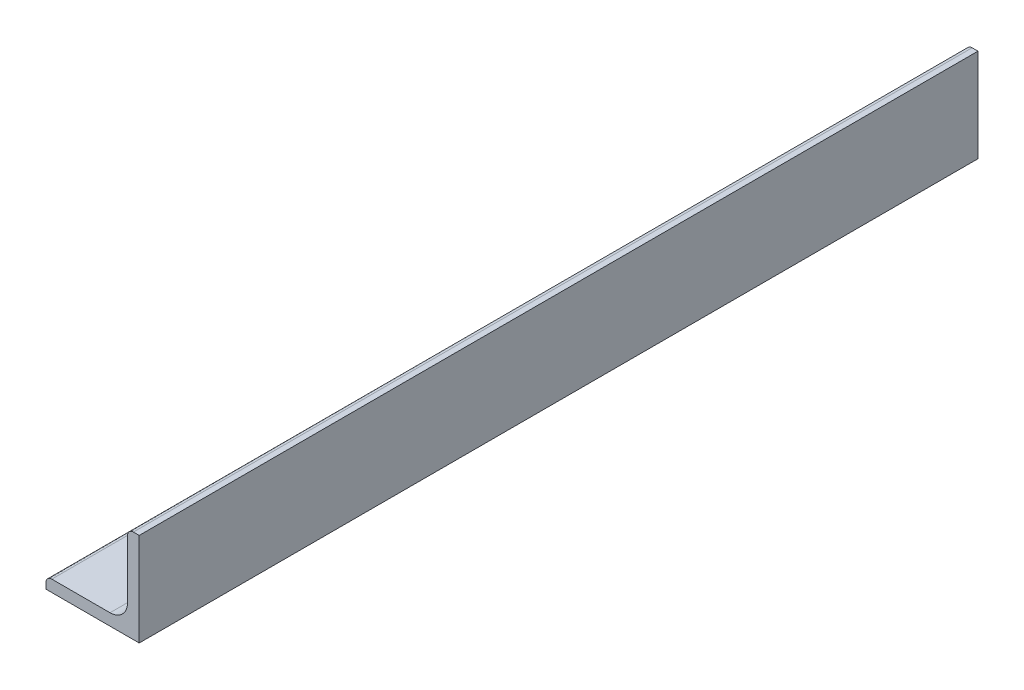
ISO-10303-21;
HEADER;
FILE_DESCRIPTION(('STEP AP214'),'2;1');
FILE_NAME('part.step','',(''),(''),'','','');
FILE_SCHEMA(('AUTOMOTIVE_DESIGN { 1 0 10303 214 1 1 1 1 }'));
ENDSEC;
DATA;
#1=APPLICATION_CONTEXT('core data for automotive mechanical design processes');
#2=APPLICATION_PROTOCOL_DEFINITION('international standard','automotive_design',2000,#1);
#3=PRODUCT_CONTEXT('',#1,'mechanical');
#4=PRODUCT('Part','Part','',(#3));
#5=PRODUCT_RELATED_PRODUCT_CATEGORY('part','',(#4));
#6=PRODUCT_DEFINITION_FORMATION('','',#4);
#7=PRODUCT_DEFINITION_CONTEXT('part definition',#1,'design');
#8=PRODUCT_DEFINITION('design','',#6,#7);
#9=PRODUCT_DEFINITION_SHAPE('','',#8);
#10=(LENGTH_UNIT() NAMED_UNIT(*) SI_UNIT(.MILLI.,.METRE.));
#11=(NAMED_UNIT(*) PLANE_ANGLE_UNIT() SI_UNIT($,.RADIAN.));
#12=(NAMED_UNIT(*) SI_UNIT($,.STERADIAN.) SOLID_ANGLE_UNIT());
#13=UNCERTAINTY_MEASURE_WITH_UNIT(LENGTH_MEASURE(1.E-05),#10,'distance_accuracy_value','');
#14=(GEOMETRIC_REPRESENTATION_CONTEXT(3) GLOBAL_UNCERTAINTY_ASSIGNED_CONTEXT((#13)) GLOBAL_UNIT_ASSIGNED_CONTEXT((#10,
#11,#12)) REPRESENTATION_CONTEXT('',''));
#15=CARTESIAN_POINT('',(0.,0.,0.));
#16=DIRECTION('',(0.,0.,1.));
#17=DIRECTION('',(1.,0.,0.));
#18=AXIS2_PLACEMENT_3D('',#15,#16,#17);
#19=CARTESIAN_POINT('',(-12.7,-11.1125,114.3));
#20=DIRECTION('',(1.,0.,0.));
#21=DIRECTION('',(0.,1.,0.));
#22=AXIS2_PLACEMENT_3D('',#19,#20,#21);
#23=PLANE('',#22);
#24=DIRECTION('',(0.,-1.,0.));
#25=VECTOR('',#24,1.);
#26=CARTESIAN_POINT('',(-12.7,-11.1125,-114.3));
#27=LINE('',#26,#25);
#28=CARTESIAN_POINT('',(-12.7,-11.1125,-114.3));
#29=VERTEX_POINT('',#28);
#30=CARTESIAN_POINT('',(-12.7,-12.7,-114.3));
#31=VERTEX_POINT('',#30);
#32=EDGE_CURVE('E152',#29,#31,#27,.T.);
#33=ORIENTED_EDGE('',*,*,#32,.T.);
#34=DIRECTION('',(0.,0.,-1.));
#35=VECTOR('',#34,1.);
#36=CARTESIAN_POINT('',(-12.7,-12.7,114.3));
#37=LINE('',#36,#35);
#38=CARTESIAN_POINT('',(-12.7,-12.7,114.3));
#39=VERTEX_POINT('',#38);
#40=EDGE_CURVE('E11',#39,#31,#37,.T.);
#41=ORIENTED_EDGE('',*,*,#40,.F.);
#42=DIRECTION('',(0.,-1.,0.));
#43=VECTOR('',#42,1.);
#44=CARTESIAN_POINT('',(-12.7,-11.1125,114.3));
#45=LINE('',#44,#43);
#46=CARTESIAN_POINT('',(-12.7,-11.1125,114.3));
#47=VERTEX_POINT('',#46);
#48=EDGE_CURVE('E177',#47,#39,#45,.T.);
#49=ORIENTED_EDGE('',*,*,#48,.F.);
#50=DIRECTION('',(0.,0.,-1.));
#51=VECTOR('',#50,1.);
#52=CARTESIAN_POINT('',(-12.7,-11.1125,114.3));
#53=LINE('',#52,#51);
#54=EDGE_CURVE('E148',#47,#29,#53,.T.);
#55=ORIENTED_EDGE('',*,*,#54,.T.);
#56=EDGE_LOOP('',(#33,#41,#49,#55));
#57=FACE_BOUND('',#56,.T.);
#58=ADVANCED_FACE('F45',(#57),#23,.F.);
#59=CARTESIAN_POINT('',(-12.7,-12.7,114.3));
#60=DIRECTION('',(0.,1.,0.));
#61=DIRECTION('',(-1.,0.,0.));
#62=AXIS2_PLACEMENT_3D('',#59,#60,#61);
#63=PLANE('',#62);
#64=DIRECTION('',(1.,0.,0.));
#65=VECTOR('',#64,1.);
#66=CARTESIAN_POINT('',(-12.7,-12.7,-114.3));
#67=LINE('',#66,#65);
#68=CARTESIAN_POINT('',(12.7,-12.7,-114.3));
#69=VERTEX_POINT('',#68);
#70=EDGE_CURVE('E156',#31,#69,#67,.T.);
#71=ORIENTED_EDGE('',*,*,#70,.T.);
#72=DIRECTION('',(0.,0.,-1.));
#73=VECTOR('',#72,1.);
#74=CARTESIAN_POINT('',(12.7,-12.7,114.3));
#75=LINE('',#74,#73);
#76=CARTESIAN_POINT('',(12.7,-12.7,114.3));
#77=VERTEX_POINT('',#76);
#78=EDGE_CURVE('E54',#77,#69,#75,.T.);
#79=ORIENTED_EDGE('',*,*,#78,.F.);
#80=DIRECTION('',(1.,0.,0.));
#81=VECTOR('',#80,1.);
#82=CARTESIAN_POINT('',(-12.7,-12.7,114.3));
#83=LINE('',#82,#81);
#84=EDGE_CURVE('E108',#39,#77,#83,.T.);
#85=ORIENTED_EDGE('',*,*,#84,.F.);
#86=ORIENTED_EDGE('',*,*,#40,.T.);
#87=EDGE_LOOP('',(#71,#79,#85,#86));
#88=FACE_BOUND('',#87,.T.);
#89=ADVANCED_FACE('F233',(#88),#63,.F.);
#90=CARTESIAN_POINT('',(12.7,-12.7,114.3));
#91=DIRECTION('',(-1.,0.,0.));
#92=DIRECTION('',(0.,-1.,0.));
#93=AXIS2_PLACEMENT_3D('',#90,#91,#92);
#94=PLANE('',#93);
#95=DIRECTION('',(0.,1.,0.));
#96=VECTOR('',#95,1.);
#97=CARTESIAN_POINT('',(12.7,-12.7,-114.3));
#98=LINE('',#97,#96);
#99=CARTESIAN_POINT('',(12.7,12.7,-114.3));
#100=VERTEX_POINT('',#99);
#101=EDGE_CURVE('E159',#69,#100,#98,.T.);
#102=ORIENTED_EDGE('',*,*,#101,.T.);
#103=DIRECTION('',(0.,0.,-1.));
#104=VECTOR('',#103,1.);
#105=CARTESIAN_POINT('',(12.7,12.7,114.3));
#106=LINE('',#105,#104);
#107=CARTESIAN_POINT('',(12.7,12.7,114.3));
#108=VERTEX_POINT('',#107);
#109=EDGE_CURVE('E192',#108,#100,#106,.T.);
#110=ORIENTED_EDGE('',*,*,#109,.F.);
#111=DIRECTION('',(0.,1.,0.));
#112=VECTOR('',#111,1.);
#113=CARTESIAN_POINT('',(12.7,-12.7,114.3));
#114=LINE('',#113,#112);
#115=EDGE_CURVE('E202',#77,#108,#114,.T.);
#116=ORIENTED_EDGE('',*,*,#115,.F.);
#117=ORIENTED_EDGE('',*,*,#78,.T.);
#118=EDGE_LOOP('',(#102,#110,#116,#117));
#119=FACE_BOUND('',#118,.T.);
#120=ADVANCED_FACE('F200',(#119),#94,.F.);
#121=CARTESIAN_POINT('',(11.1125,12.7,114.3));
#122=DIRECTION('',(0.,-1.,0.));
#123=DIRECTION('',(0.,0.,-1.));
#124=AXIS2_PLACEMENT_3D('',#121,#122,#123);
#125=PLANE('',#124);
#126=DIRECTION('',(-1.,0.,0.));
#127=VECTOR('',#126,1.);
#128=CARTESIAN_POINT('',(11.1125,12.7,-114.3));
#129=LINE('',#128,#127);
#130=CARTESIAN_POINT('',(11.1125,12.7,-114.3));
#131=VERTEX_POINT('',#130);
#132=EDGE_CURVE('E162',#100,#131,#129,.T.);
#133=ORIENTED_EDGE('',*,*,#132,.T.);
#134=DIRECTION('',(0.,0.,-1.));
#135=VECTOR('',#134,1.);
#136=CARTESIAN_POINT('',(11.1125,12.7,114.3));
#137=LINE('',#136,#135);
#138=CARTESIAN_POINT('',(11.1125,12.7,114.3));
#139=VERTEX_POINT('',#138);
#140=EDGE_CURVE('E188',#139,#131,#137,.T.);
#141=ORIENTED_EDGE('',*,*,#140,.F.);
#142=DIRECTION('',(-1.,0.,0.));
#143=VECTOR('',#142,1.);
#144=CARTESIAN_POINT('',(11.1125,12.7,114.3));
#145=LINE('',#144,#143);
#146=EDGE_CURVE('E219',#108,#139,#145,.T.);
#147=ORIENTED_EDGE('',*,*,#146,.F.);
#148=ORIENTED_EDGE('',*,*,#109,.T.);
#149=EDGE_LOOP('',(#133,#141,#147,#148));
#150=FACE_BOUND('',#149,.T.);
#151=ADVANCED_FACE('F211',(#150),#125,.F.);
#152=CARTESIAN_POINT('',(11.1125,11.1125,114.3));
#153=DIRECTION('',(0.,0.,-1.));
#154=DIRECTION('',(-1.,0.,0.));
#155=AXIS2_PLACEMENT_3D('',#152,#153,#154);
#156=CYLINDRICAL_SURFACE('',#155,1.5875);
#157=CARTESIAN_POINT('',(11.1125,11.1125,-114.3));
#158=DIRECTION('',(0.,0.,1.));
#159=DIRECTION('',(-1.,0.,0.));
#160=AXIS2_PLACEMENT_3D('',#157,#158,#159);
#161=CIRCLE('',#160,1.5875);
#162=CARTESIAN_POINT('',(9.525,11.1125,-114.3));
#163=VERTEX_POINT('',#162);
#164=EDGE_CURVE('E165',#131,#163,#161,.T.);
#165=ORIENTED_EDGE('',*,*,#164,.T.);
#166=DIRECTION('',(0.,0.,-1.));
#167=VECTOR('',#166,1.);
#168=CARTESIAN_POINT('',(9.525,11.1125,114.3));
#169=LINE('',#168,#167);
#170=CARTESIAN_POINT('',(9.525,11.1125,114.3));
#171=VERTEX_POINT('',#170);
#172=EDGE_CURVE('E184',#171,#163,#169,.T.);
#173=ORIENTED_EDGE('',*,*,#172,.F.);
#174=CARTESIAN_POINT('',(11.1125,11.1125,114.3));
#175=DIRECTION('',(0.,0.,1.));
#176=DIRECTION('',(-1.,0.,0.));
#177=AXIS2_PLACEMENT_3D('',#174,#175,#176);
#178=CIRCLE('',#177,1.5875);
#179=EDGE_CURVE('E217',#139,#171,#178,.T.);
#180=ORIENTED_EDGE('',*,*,#179,.F.);
#181=ORIENTED_EDGE('',*,*,#140,.T.);
#182=EDGE_LOOP('',(#165,#173,#180,#181));
#183=FACE_BOUND('',#182,.T.);
#184=ADVANCED_FACE('F215',(#183),#156,.T.);
#185=CARTESIAN_POINT('',(9.525,11.1125,114.3));
#186=DIRECTION('',(1.,0.,0.));
#187=DIRECTION('',(0.,0.,-1.));
#188=AXIS2_PLACEMENT_3D('',#185,#186,#187);
#189=PLANE('',#188);
#190=DIRECTION('',(0.,-1.,0.));
#191=VECTOR('',#190,1.);
#192=CARTESIAN_POINT('',(9.525,11.1125,-114.3));
#193=LINE('',#192,#191);
#194=CARTESIAN_POINT('',(9.525,-4.74979999999999,-114.3));
#195=VERTEX_POINT('',#194);
#196=EDGE_CURVE('E168',#163,#195,#193,.T.);
#197=ORIENTED_EDGE('',*,*,#196,.T.);
#198=DIRECTION('',(0.,0.,-1.));
#199=VECTOR('',#198,1.);
#200=CARTESIAN_POINT('',(9.525,-4.74979999999999,114.3));
#201=LINE('',#200,#199);
#202=CARTESIAN_POINT('',(9.525,-4.74979999999999,114.3));
#203=VERTEX_POINT('',#202);
#204=EDGE_CURVE('E141',#203,#195,#201,.T.);
#205=ORIENTED_EDGE('',*,*,#204,.F.);
#206=DIRECTION('',(0.,-1.,0.));
#207=VECTOR('',#206,1.);
#208=CARTESIAN_POINT('',(9.525,11.1125,114.3));
#209=LINE('',#208,#207);
#210=EDGE_CURVE('E130',#171,#203,#209,.T.);
#211=ORIENTED_EDGE('',*,*,#210,.F.);
#212=ORIENTED_EDGE('',*,*,#172,.T.);
#213=EDGE_LOOP('',(#197,#205,#211,#212));
#214=FACE_BOUND('',#213,.T.);
#215=ADVANCED_FACE('F245',(#214),#189,.F.);
#216=CARTESIAN_POINT('',(4.7498,-4.74979999999999,114.3));
#217=DIRECTION('',(0.,0.,-1.));
#218=DIRECTION('',(-1.,0.,0.));
#219=AXIS2_PLACEMENT_3D('',#216,#217,#218);
#220=CYLINDRICAL_SURFACE('',#219,4.7752);
#221=CARTESIAN_POINT('',(4.7498,-4.74979999999999,-114.3));
#222=DIRECTION('',(0.,0.,-1.));
#223=DIRECTION('',(-1.,0.,0.));
#224=AXIS2_PLACEMENT_3D('',#221,#222,#223);
#225=CIRCLE('',#224,4.7752);
#226=CARTESIAN_POINT('',(4.7498,-9.525,-114.3));
#227=VERTEX_POINT('',#226);
#228=EDGE_CURVE('E139',#195,#227,#225,.T.);
#229=ORIENTED_EDGE('',*,*,#228,.T.);
#230=DIRECTION('',(0.,0.,-1.));
#231=VECTOR('',#230,1.);
#232=CARTESIAN_POINT('',(4.7498,-9.525,114.3));
#233=LINE('',#232,#231);
#234=CARTESIAN_POINT('',(4.7498,-9.525,114.3));
#235=VERTEX_POINT('',#234);
#236=EDGE_CURVE('E136',#235,#227,#233,.T.);
#237=ORIENTED_EDGE('',*,*,#236,.F.);
#238=CARTESIAN_POINT('',(4.7498,-4.74979999999999,114.3));
#239=DIRECTION('',(0.,0.,-1.));
#240=DIRECTION('',(-1.,0.,0.));
#241=AXIS2_PLACEMENT_3D('',#238,#239,#240);
#242=CIRCLE('',#241,4.7752);
#243=EDGE_CURVE('E124',#203,#235,#242,.T.);
#244=ORIENTED_EDGE('',*,*,#243,.F.);
#245=ORIENTED_EDGE('',*,*,#204,.T.);
#246=EDGE_LOOP('',(#229,#237,#244,#245));
#247=FACE_BOUND('',#246,.T.);
#248=ADVANCED_FACE('F137',(#247),#220,.F.);
#249=CARTESIAN_POINT('',(4.7498,-9.525,114.3));
#250=DIRECTION('',(0.,-1.,0.));
#251=DIRECTION('',(1.,0.,0.));
#252=AXIS2_PLACEMENT_3D('',#249,#250,#251);
#253=PLANE('',#252);
#254=DIRECTION('',(-1.,0.,0.));
#255=VECTOR('',#254,1.);
#256=CARTESIAN_POINT('',(4.7498,-9.525,-114.3));
#257=LINE('',#256,#255);
#258=CARTESIAN_POINT('',(-11.1125,-9.525,-114.3));
#259=VERTEX_POINT('',#258);
#260=EDGE_CURVE('E94',#227,#259,#257,.T.);
#261=ORIENTED_EDGE('',*,*,#260,.T.);
#262=DIRECTION('',(0.,0.,-1.));
#263=VECTOR('',#262,1.);
#264=CARTESIAN_POINT('',(-11.1125,-9.525,114.3));
#265=LINE('',#264,#263);
#266=CARTESIAN_POINT('',(-11.1125,-9.525,114.3));
#267=VERTEX_POINT('',#266);
#268=EDGE_CURVE('E142',#267,#259,#265,.T.);
#269=ORIENTED_EDGE('',*,*,#268,.F.);
#270=DIRECTION('',(-1.,0.,0.));
#271=VECTOR('',#270,1.);
#272=CARTESIAN_POINT('',(4.7498,-9.525,114.3));
#273=LINE('',#272,#271);
#274=EDGE_CURVE('E128',#235,#267,#273,.T.);
#275=ORIENTED_EDGE('',*,*,#274,.F.);
#276=ORIENTED_EDGE('',*,*,#236,.T.);
#277=EDGE_LOOP('',(#261,#269,#275,#276));
#278=FACE_BOUND('',#277,.T.);
#279=ADVANCED_FACE('F144',(#278),#253,.F.);
#280=CARTESIAN_POINT('',(-11.1125,-11.1125,114.3));
#281=DIRECTION('',(0.,0.,-1.));
#282=DIRECTION('',(-1.,0.,0.));
#283=AXIS2_PLACEMENT_3D('',#280,#281,#282);
#284=CYLINDRICAL_SURFACE('',#283,1.5875);
#285=CARTESIAN_POINT('',(-11.1125,-11.1125,-114.3));
#286=DIRECTION('',(0.,0.,1.));
#287=DIRECTION('',(-1.,0.,0.));
#288=AXIS2_PLACEMENT_3D('',#285,#286,#287);
#289=CIRCLE('',#288,1.5875);
#290=EDGE_CURVE('E100',#259,#29,#289,.T.);
#291=ORIENTED_EDGE('',*,*,#290,.T.);
#292=ORIENTED_EDGE('',*,*,#54,.F.);
#293=CARTESIAN_POINT('',(-11.1125,-11.1125,114.3));
#294=DIRECTION('',(0.,0.,1.));
#295=DIRECTION('',(-1.,0.,0.));
#296=AXIS2_PLACEMENT_3D('',#293,#294,#295);
#297=CIRCLE('',#296,1.5875);
#298=EDGE_CURVE('E62',#267,#47,#297,.T.);
#299=ORIENTED_EDGE('',*,*,#298,.F.);
#300=ORIENTED_EDGE('',*,*,#268,.T.);
#301=EDGE_LOOP('',(#291,#292,#299,#300));
#302=FACE_BOUND('',#301,.T.);
#303=ADVANCED_FACE('F253',(#302),#284,.T.);
#304=CARTESIAN_POINT('',(11.1125,11.1125,114.3));
#305=DIRECTION('',(0.,0.,-1.));
#306=DIRECTION('',(-1.,0.,0.));
#307=AXIS2_PLACEMENT_3D('',#304,#305,#306);
#308=PLANE('',#307);
#309=ORIENTED_EDGE('',*,*,#48,.T.);
#310=ORIENTED_EDGE('',*,*,#84,.T.);
#311=ORIENTED_EDGE('',*,*,#115,.T.);
#312=ORIENTED_EDGE('',*,*,#146,.T.);
#313=ORIENTED_EDGE('',*,*,#179,.T.);
#314=ORIENTED_EDGE('',*,*,#210,.T.);
#315=ORIENTED_EDGE('',*,*,#243,.T.);
#316=ORIENTED_EDGE('',*,*,#274,.T.);
#317=ORIENTED_EDGE('',*,*,#298,.T.);
#318=EDGE_LOOP('',(#309,#310,#311,#312,#313,#314,#315,#316,#317));
#319=FACE_BOUND('',#318,.T.);
#320=ADVANCED_FACE('F126',(#319),#308,.F.);
#321=CARTESIAN_POINT('',(11.1125,11.1125,-114.3));
#322=DIRECTION('',(0.,0.,-1.));
#323=DIRECTION('',(-1.,0.,0.));
#324=AXIS2_PLACEMENT_3D('',#321,#322,#323);
#325=PLANE('',#324);
#326=ORIENTED_EDGE('',*,*,#32,.F.);
#327=ORIENTED_EDGE('',*,*,#290,.F.);
#328=ORIENTED_EDGE('',*,*,#260,.F.);
#329=ORIENTED_EDGE('',*,*,#228,.F.);
#330=ORIENTED_EDGE('',*,*,#196,.F.);
#331=ORIENTED_EDGE('',*,*,#164,.F.);
#332=ORIENTED_EDGE('',*,*,#132,.F.);
#333=ORIENTED_EDGE('',*,*,#101,.F.);
#334=ORIENTED_EDGE('',*,*,#70,.F.);
#335=EDGE_LOOP('',(#326,#327,#328,#329,#330,#331,#332,#333,#334));
#336=FACE_BOUND('',#335,.T.);
#337=ADVANCED_FACE('F206',(#336),#325,.T.);
#338=CLOSED_SHELL('',(#58,#89,#120,#151,#184,#215,#248,#279,#303,#320,#337));
#339=MANIFOLD_SOLID_BREP('B2',#338);
#340=ADVANCED_BREP_SHAPE_REPRESENTATION('',(#18,#339),#14);
#341=SHAPE_DEFINITION_REPRESENTATION(#9,#340);
ENDSEC;
END-ISO-10303-21;
